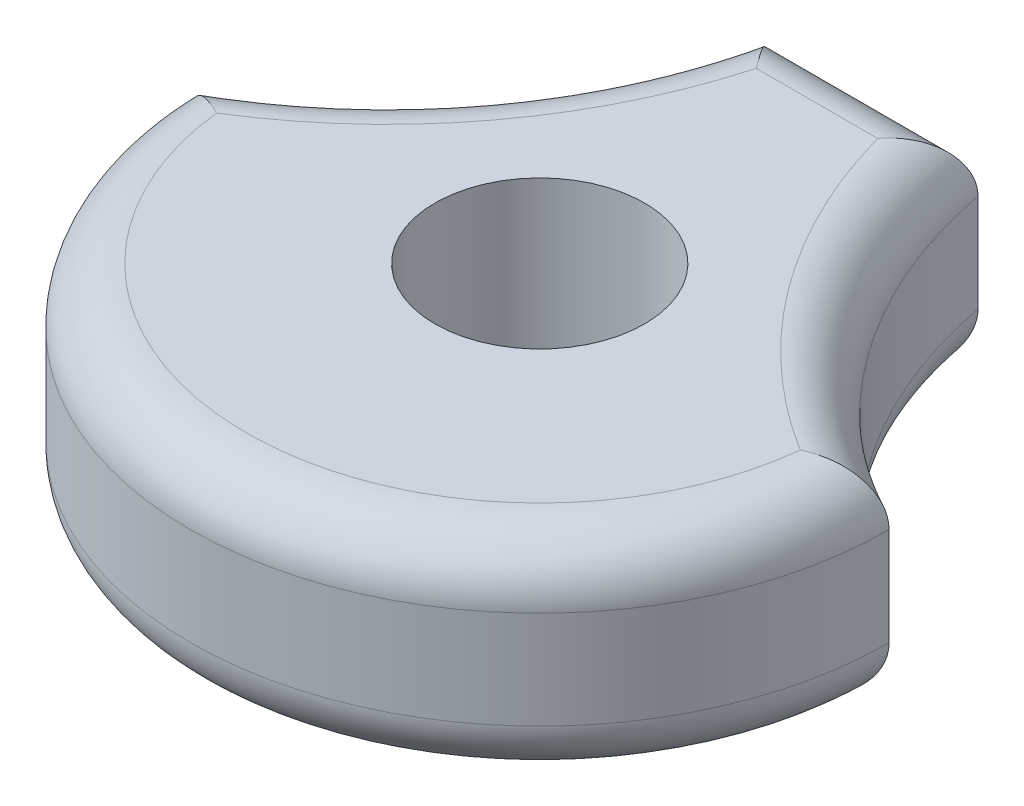
ISO-10303-21;
HEADER;
FILE_DESCRIPTION(('STEP AP214'),'2;1');
FILE_NAME('part.step','',(''),(''),'','','');
FILE_SCHEMA(('AUTOMOTIVE_DESIGN { 1 0 10303 214 1 1 1 1 }'));
ENDSEC;
DATA;
#1=APPLICATION_CONTEXT('core data for automotive mechanical design processes');
#2=APPLICATION_PROTOCOL_DEFINITION('international standard','automotive_design',2000,#1);
#3=PRODUCT_CONTEXT('',#1,'mechanical');
#4=PRODUCT('Part','Part','',(#3));
#5=PRODUCT_RELATED_PRODUCT_CATEGORY('part','',(#4));
#6=PRODUCT_DEFINITION_FORMATION('','',#4);
#7=PRODUCT_DEFINITION_CONTEXT('part definition',#1,'design');
#8=PRODUCT_DEFINITION('design','',#6,#7);
#9=PRODUCT_DEFINITION_SHAPE('','',#8);
#10=(LENGTH_UNIT() NAMED_UNIT(*) SI_UNIT(.MILLI.,.METRE.));
#11=(NAMED_UNIT(*) PLANE_ANGLE_UNIT() SI_UNIT($,.RADIAN.));
#12=(NAMED_UNIT(*) SI_UNIT($,.STERADIAN.) SOLID_ANGLE_UNIT());
#13=UNCERTAINTY_MEASURE_WITH_UNIT(LENGTH_MEASURE(1.E-05),#10,'distance_accuracy_value','');
#14=(GEOMETRIC_REPRESENTATION_CONTEXT(3) GLOBAL_UNCERTAINTY_ASSIGNED_CONTEXT((#13)) GLOBAL_UNIT_ASSIGNED_CONTEXT((#10,
#11,#12)) REPRESENTATION_CONTEXT('',''));
#15=CARTESIAN_POINT('',(0.,0.,0.));
#16=DIRECTION('',(0.,0.,1.));
#17=DIRECTION('',(1.,0.,0.));
#18=AXIS2_PLACEMENT_3D('',#15,#16,#17);
#19=CARTESIAN_POINT('',(-1.02382791124329,0.375,-0.750623938609286));
#20=DIRECTION('',(0.,-1.,0.));
#21=DIRECTION('',(0.,0.,-1.));
#22=AXIS2_PLACEMENT_3D('',#19,#20,#21);
#23=CYLINDRICAL_SURFACE('',#22,0.85);
#24=DIRECTION('',(0.,-1.,0.));
#25=VECTOR('',#24,1.);
#26=CARTESIAN_POINT('',(-0.188,0.375,-0.596054527706988));
#27=LINE('',#26,#25);
#28=CARTESIAN_POINT('',(-0.188,0.275,-0.596054527706988));
#29=VERTEX_POINT('',#28);
#30=CARTESIAN_POINT('',(-0.188,0.1,-0.596054527706988));
#31=VERTEX_POINT('',#30);
#32=EDGE_CURVE('E310',#29,#31,#27,.T.);
#33=ORIENTED_EDGE('',*,*,#32,.T.);
#34=CARTESIAN_POINT('',(-1.02382791124329,0.1,-0.750623938609286));
#35=DIRECTION('',(0.,1.,0.));
#36=DIRECTION('',(0.,0.,1.));
#37=AXIS2_PLACEMENT_3D('',#34,#35,#36);
#38=CIRCLE('',#37,0.85);
#39=CARTESIAN_POINT('',(-0.625,0.1,0.));
#40=VERTEX_POINT('',#39);
#41=EDGE_CURVE('E176',#31,#40,#38,.F.);
#42=ORIENTED_EDGE('',*,*,#41,.T.);
#43=DIRECTION('',(0.,-1.,0.));
#44=VECTOR('',#43,1.);
#45=CARTESIAN_POINT('',(-0.625,0.375,0.));
#46=LINE('',#45,#44);
#47=CARTESIAN_POINT('',(-0.625,0.275,0.));
#48=VERTEX_POINT('',#47);
#49=EDGE_CURVE('E134',#48,#40,#46,.T.);
#50=ORIENTED_EDGE('',*,*,#49,.F.);
#51=CARTESIAN_POINT('',(-1.02382791124329,0.275,-0.750623938609286));
#52=DIRECTION('',(0.,1.,0.));
#53=DIRECTION('',(0.,0.,1.));
#54=AXIS2_PLACEMENT_3D('',#51,#52,#53);
#55=CIRCLE('',#54,0.85);
#56=EDGE_CURVE('E172',#48,#29,#55,.T.);
#57=ORIENTED_EDGE('',*,*,#56,.T.);
#58=EDGE_LOOP('',(#33,#42,#50,#57));
#59=FACE_BOUND('',#58,.T.);
#60=ADVANCED_FACE('F39',(#59),#23,.F.);
#61=CARTESIAN_POINT('',(0.,0.375,0.));
#62=DIRECTION('',(0.,-1.,0.));
#63=DIRECTION('',(0.,0.,-1.));
#64=AXIS2_PLACEMENT_3D('',#61,#62,#63);
#65=CYLINDRICAL_SURFACE('',#64,0.625);
#66=ORIENTED_EDGE('',*,*,#49,.T.);
#67=CARTESIAN_POINT('',(0.,0.1,0.));
#68=DIRECTION('',(0.,1.,0.));
#69=DIRECTION('',(0.,0.,1.));
#70=AXIS2_PLACEMENT_3D('',#67,#68,#69);
#71=CIRCLE('',#70,0.625);
#72=CARTESIAN_POINT('',(0.625,0.1,0.));
#73=VERTEX_POINT('',#72);
#74=EDGE_CURVE('E132',#40,#73,#71,.T.);
#75=ORIENTED_EDGE('',*,*,#74,.T.);
#76=DIRECTION('',(0.,-1.,0.));
#77=VECTOR('',#76,1.);
#78=CARTESIAN_POINT('',(0.625,0.375,0.));
#79=LINE('',#78,#77);
#80=CARTESIAN_POINT('',(0.625,0.275,0.));
#81=VERTEX_POINT('',#80);
#82=EDGE_CURVE('E114',#81,#73,#79,.T.);
#83=ORIENTED_EDGE('',*,*,#82,.F.);
#84=CARTESIAN_POINT('',(0.,0.275,0.));
#85=DIRECTION('',(0.,1.,0.));
#86=DIRECTION('',(0.,0.,1.));
#87=AXIS2_PLACEMENT_3D('',#84,#85,#86);
#88=CIRCLE('',#87,0.625);
#89=EDGE_CURVE('E129',#81,#48,#88,.F.);
#90=ORIENTED_EDGE('',*,*,#89,.T.);
#91=EDGE_LOOP('',(#66,#75,#83,#90));
#92=FACE_BOUND('',#91,.T.);
#93=ADVANCED_FACE('F127',(#92),#65,.T.);
#94=CARTESIAN_POINT('',(1.02382791124329,0.375,-0.750623938609286));
#95=DIRECTION('',(0.,-1.,0.));
#96=DIRECTION('',(0.,0.,-1.));
#97=AXIS2_PLACEMENT_3D('',#94,#95,#96);
#98=CYLINDRICAL_SURFACE('',#97,0.85);
#99=ORIENTED_EDGE('',*,*,#82,.T.);
#100=CARTESIAN_POINT('',(1.02382791124329,0.1,-0.750623938609286));
#101=DIRECTION('',(0.,1.,0.));
#102=DIRECTION('',(0.,0.,1.));
#103=AXIS2_PLACEMENT_3D('',#100,#101,#102);
#104=CIRCLE('',#103,0.85);
#105=CARTESIAN_POINT('',(0.188,0.1,-0.596054527706988));
#106=VERTEX_POINT('',#105);
#107=EDGE_CURVE('E121',#73,#106,#104,.F.);
#108=ORIENTED_EDGE('',*,*,#107,.T.);
#109=DIRECTION('',(0.,-1.,0.));
#110=VECTOR('',#109,1.);
#111=CARTESIAN_POINT('',(0.188,0.375,-0.596054527706988));
#112=LINE('',#111,#110);
#113=CARTESIAN_POINT('',(0.188,0.275,-0.596054527706988));
#114=VERTEX_POINT('',#113);
#115=EDGE_CURVE('E116',#114,#106,#112,.T.);
#116=ORIENTED_EDGE('',*,*,#115,.F.);
#117=CARTESIAN_POINT('',(1.02382791124329,0.275,-0.750623938609286));
#118=DIRECTION('',(0.,1.,0.));
#119=DIRECTION('',(0.,0.,1.));
#120=AXIS2_PLACEMENT_3D('',#117,#118,#119);
#121=CIRCLE('',#120,0.85);
#122=EDGE_CURVE('E111',#114,#81,#121,.T.);
#123=ORIENTED_EDGE('',*,*,#122,.T.);
#124=EDGE_LOOP('',(#99,#108,#116,#123));
#125=FACE_BOUND('',#124,.T.);
#126=ADVANCED_FACE('F113',(#125),#98,.F.);
#127=CARTESIAN_POINT('',(-0.188,0.375,-0.596054527706988));
#128=DIRECTION('',(0.,0.,1.));
#129=DIRECTION('',(1.,0.,0.));
#130=AXIS2_PLACEMENT_3D('',#127,#128,#129);
#131=PLANE('',#130);
#132=ORIENTED_EDGE('',*,*,#115,.T.);
#133=DIRECTION('',(-1.,0.,0.));
#134=VECTOR('',#133,1.);
#135=CARTESIAN_POINT('',(-0.188,0.1,-0.596054527706988));
#136=LINE('',#135,#134);
#137=EDGE_CURVE('E169',#106,#31,#136,.T.);
#138=ORIENTED_EDGE('',*,*,#137,.T.);
#139=ORIENTED_EDGE('',*,*,#32,.F.);
#140=DIRECTION('',(-1.,0.,0.));
#141=VECTOR('',#140,1.);
#142=CARTESIAN_POINT('',(0.188,0.275,-0.596054527706988));
#143=LINE('',#142,#141);
#144=EDGE_CURVE('E166',#29,#114,#143,.F.);
#145=ORIENTED_EDGE('',*,*,#144,.T.);
#146=EDGE_LOOP('',(#132,#138,#139,#145));
#147=FACE_BOUND('',#146,.T.);
#148=ADVANCED_FACE('F273',(#147),#131,.F.);
#149=CARTESIAN_POINT('',(-1.02382791124329,0.375,-0.750623938609286));
#150=DIRECTION('',(0.,1.,0.));
#151=DIRECTION('',(0.,0.,1.));
#152=AXIS2_PLACEMENT_3D('',#149,#150,#151);
#153=PLANE('',#152);
#154=DIRECTION('',(-1.,0.,0.));
#155=VECTOR('',#154,1.);
#156=CARTESIAN_POINT('',(-0.188,0.375,-0.496054527706987));
#157=LINE('',#156,#155);
#158=CARTESIAN_POINT('',(0.108571436241412,0.375,-0.496054527706991));
#159=VERTEX_POINT('',#158);
#160=CARTESIAN_POINT('',(-0.108571436241412,0.375,-0.496054527706987));
#161=VERTEX_POINT('',#160);
#162=EDGE_CURVE('E54',#159,#161,#157,.T.);
#163=ORIENTED_EDGE('',*,*,#162,.T.);
#164=CARTESIAN_POINT('',(-1.02382791124329,0.375,-0.750623938609286));
#165=DIRECTION('',(0.,1.,0.));
#166=DIRECTION('',(0.,0.,1.));
#167=AXIS2_PLACEMENT_3D('',#164,#165,#166);
#168=CIRCLE('',#167,0.95);
#169=CARTESIAN_POINT('',(-0.522002833056028,0.375,0.0560182316882701));
#170=VERTEX_POINT('',#169);
#171=EDGE_CURVE('E11',#161,#170,#168,.F.);
#172=ORIENTED_EDGE('',*,*,#171,.T.);
#173=CARTESIAN_POINT('',(0.,0.375,0.));
#174=DIRECTION('',(0.,1.,0.));
#175=DIRECTION('',(0.,0.,1.));
#176=AXIS2_PLACEMENT_3D('',#173,#174,#175);
#177=CIRCLE('',#176,0.525);
#178=CARTESIAN_POINT('',(0.522002833056028,0.375,0.0560182316882701));
#179=VERTEX_POINT('',#178);
#180=EDGE_CURVE('E179',#170,#179,#177,.T.);
#181=ORIENTED_EDGE('',*,*,#180,.T.);
#182=CARTESIAN_POINT('',(1.02382791124329,0.375,-0.750623938609286));
#183=DIRECTION('',(0.,1.,0.));
#184=DIRECTION('',(0.,0.,1.));
#185=AXIS2_PLACEMENT_3D('',#182,#183,#184);
#186=CIRCLE('',#185,0.95);
#187=EDGE_CURVE('E65',#179,#159,#186,.F.);
#188=ORIENTED_EDGE('',*,*,#187,.T.);
#189=EDGE_LOOP('',(#163,#172,#181,#188));
#190=FACE_BOUND('',#189,.T.);
#191=CARTESIAN_POINT('',(0.,0.375,0.));
#192=DIRECTION('',(0.,1.,0.));
#193=DIRECTION('',(0.,0.,1.));
#194=AXIS2_PLACEMENT_3D('',#191,#192,#193);
#195=CIRCLE('',#194,0.1875);
#196=CARTESIAN_POINT('',(0.,0.375,0.1875));
#197=VERTEX_POINT('',#196);
#198=EDGE_CURVE('E228',#197,#197,#195,.T.);
#199=ORIENTED_EDGE('',*,*,#198,.F.);
#200=EDGE_LOOP('',(#199));
#201=FACE_BOUND('',#200,.T.);
#202=ADVANCED_FACE('F276',(#190,#201),#153,.T.);
#203=CARTESIAN_POINT('',(-1.02382791124329,0.,-0.750623938609286));
#204=DIRECTION('',(0.,1.,0.));
#205=DIRECTION('',(0.,0.,1.));
#206=AXIS2_PLACEMENT_3D('',#203,#204,#205);
#207=PLANE('',#206);
#208=CARTESIAN_POINT('',(0.,0.,-0.375));
#209=DIRECTION('',(0.,-1.,0.));
#210=DIRECTION('',(0.,0.,-1.));
#211=AXIS2_PLACEMENT_3D('',#208,#209,#210);
#212=CIRCLE('',#211,0.0935);
#213=CARTESIAN_POINT('',(0.,0.,-0.4685));
#214=VERTEX_POINT('',#213);
#215=EDGE_CURVE('E300',#214,#214,#212,.T.);
#216=ORIENTED_EDGE('',*,*,#215,.F.);
#217=EDGE_LOOP('',(#216));
#218=FACE_BOUND('',#217,.T.);
#219=CARTESIAN_POINT('',(1.02382791124329,0.,-0.750623938609286));
#220=DIRECTION('',(0.,1.,0.));
#221=DIRECTION('',(0.,0.,1.));
#222=AXIS2_PLACEMENT_3D('',#219,#220,#221);
#223=CIRCLE('',#222,0.95);
#224=CARTESIAN_POINT('',(0.108571436241412,0.,-0.496054527706987));
#225=VERTEX_POINT('',#224);
#226=CARTESIAN_POINT('',(0.522002833056028,0.,0.0560182316882701));
#227=VERTEX_POINT('',#226);
#228=EDGE_CURVE('E158',#225,#227,#223,.T.);
#229=ORIENTED_EDGE('',*,*,#228,.T.);
#230=CARTESIAN_POINT('',(0.,0.,0.));
#231=DIRECTION('',(0.,1.,0.));
#232=DIRECTION('',(0.,0.,1.));
#233=AXIS2_PLACEMENT_3D('',#230,#231,#232);
#234=CIRCLE('',#233,0.525);
#235=CARTESIAN_POINT('',(-0.522002833056028,0.,0.0560182316882701));
#236=VERTEX_POINT('',#235);
#237=EDGE_CURVE('E122',#227,#236,#234,.F.);
#238=ORIENTED_EDGE('',*,*,#237,.T.);
#239=CARTESIAN_POINT('',(-1.02382791124329,0.,-0.750623938609286));
#240=DIRECTION('',(0.,1.,0.));
#241=DIRECTION('',(0.,0.,1.));
#242=AXIS2_PLACEMENT_3D('',#239,#240,#241);
#243=CIRCLE('',#242,0.95);
#244=CARTESIAN_POINT('',(-0.108571436241412,0.,-0.496054527706991));
#245=VERTEX_POINT('',#244);
#246=EDGE_CURVE('E149',#236,#245,#243,.T.);
#247=ORIENTED_EDGE('',*,*,#246,.T.);
#248=DIRECTION('',(-1.,0.,0.));
#249=VECTOR('',#248,1.);
#250=CARTESIAN_POINT('',(-1.02382791124329,0.,-0.496054527706987));
#251=LINE('',#250,#249);
#252=EDGE_CURVE('E155',#245,#225,#251,.F.);
#253=ORIENTED_EDGE('',*,*,#252,.T.);
#254=EDGE_LOOP('',(#229,#238,#247,#253));
#255=FACE_BOUND('',#254,.T.);
#256=CARTESIAN_POINT('',(0.,0.,0.));
#257=DIRECTION('',(0.,1.,0.));
#258=DIRECTION('',(0.,0.,1.));
#259=AXIS2_PLACEMENT_3D('',#256,#257,#258);
#260=CIRCLE('',#259,0.1875);
#261=CARTESIAN_POINT('',(0.,0.,0.1875));
#262=VERTEX_POINT('',#261);
#263=EDGE_CURVE('E306',#262,#262,#260,.T.);
#264=ORIENTED_EDGE('',*,*,#263,.T.);
#265=EDGE_LOOP('',(#264));
#266=FACE_BOUND('',#265,.T.);
#267=ADVANCED_FACE('F278',(#218,#255,#266),#207,.F.);
#268=CARTESIAN_POINT('',(0.,0.,0.));
#269=DIRECTION('',(0.,1.,0.));
#270=DIRECTION('',(0.,0.,1.));
#271=AXIS2_PLACEMENT_3D('',#268,#269,#270);
#272=CYLINDRICAL_SURFACE('',#271,0.1875);
#273=ORIENTED_EDGE('',*,*,#263,.F.);
#274=EDGE_LOOP('',(#273));
#275=FACE_BOUND('',#274,.T.);
#276=ORIENTED_EDGE('',*,*,#198,.T.);
#277=EDGE_LOOP('',(#276));
#278=FACE_BOUND('',#277,.T.);
#279=ADVANCED_FACE('F281',(#275,#278),#272,.F.);
#280=CARTESIAN_POINT('',(-0.188,0.1,-0.496054527706987));
#281=DIRECTION('',(-1.,0.,0.));
#282=DIRECTION('',(0.,0.,1.));
#283=AXIS2_PLACEMENT_3D('',#280,#281,#282);
#284=CYLINDRICAL_SURFACE('',#283,0.1);
#285=CARTESIAN_POINT('',(0.188,0.1,-0.596054527706988));
#286=CARTESIAN_POINT('',(0.188006563340456,0.0952662798120291,-0.59606183198076));
#287=CARTESIAN_POINT('',(0.187720766170187,0.0905421641596065,-0.595718934787511));
#288=CARTESIAN_POINT('',(0.186620382605794,0.081281186151583,-0.594395381848338));
#289=CARTESIAN_POINT('',(0.185809635655904,0.0767432165946548,-0.593419356659604));
#290=CARTESIAN_POINT('',(0.183716041360385,0.067959406024845,-0.590893235565373));
#291=CARTESIAN_POINT('',(0.182434181668559,0.0637129757664542,-0.589344340597115));
#292=CARTESIAN_POINT('',(0.179473353596753,0.0555760245358786,-0.585755792830976));
#293=CARTESIAN_POINT('',(0.177793647235535,0.0516861838407015,-0.583715227892333));
#294=CARTESIAN_POINT('',(0.173502032914405,0.0430912270278644,-0.578482792029683));
#295=CARTESIAN_POINT('',(0.170765750086057,0.0385439237631463,-0.575133575737485));
#296=CARTESIAN_POINT('',(0.164881521839847,0.0302136238312448,-0.567890750637346));
#297=CARTESIAN_POINT('',(0.161732895569461,0.0264319181886154,-0.56399624070031));
#298=CARTESIAN_POINT('',(0.15429624347707,0.018755514702494,-0.55474205475707));
#299=CARTESIAN_POINT('',(0.149924285663846,0.0150850803185265,-0.549264102862823));
#300=CARTESIAN_POINT('',(0.140913049677504,0.00893772115778066,-0.537881922335268));
#301=CARTESIAN_POINT('',(0.136273682467073,0.00646119650842118,-0.531977551552962));
#302=CARTESIAN_POINT('',(0.127981869878933,0.00312903927751003,-0.521339027827265));
#303=CARTESIAN_POINT('',(0.124355701067012,0.00202851145660351,-0.516658622885531));
#304=CARTESIAN_POINT('',(0.117083225795594,0.000509951573807847,-0.507214273394175));
#305=CARTESIAN_POINT('',(0.113436971678063,9.060700672305E-05,-0.502450507418318));
#306=CARTESIAN_POINT('',(0.10939341960956,4.3855613286069E-06,-0.497135978271487));
#307=CARTESIAN_POINT('',(0.108982318322315,-8.66163361649267E-10,-0.496595292339174));
#308=CARTESIAN_POINT('',(0.108571436241413,0.,-0.496054527706987));
#309=B_SPLINE_CURVE_WITH_KNOTS('',3,(#285,#286,#287,#288,#289,#290,#291,#292,#293,#294,#295,
#296,#297,#298,#299,#300,#301,#302,#303,#304,#305,#306,#307,#308),.UNSPECIFIED.,.F.,.F.,(4,2,2,
2,2,2,2,2,2,2,2,4),(0.,0.0141649397828813,0.028227430937291,0.0422606077133319,
0.0563200218986589,0.075045017196368,0.0938013300918819,0.117413981718386,0.141034541407169,
0.159065059166736,0.17706079430339,0.179098443734128),.UNSPECIFIED.);
#310=EDGE_CURVE('E229',#225,#106,#309,.F.);
#311=ORIENTED_EDGE('',*,*,#310,.F.);
#312=ORIENTED_EDGE('',*,*,#252,.F.);
#313=CARTESIAN_POINT('',(-0.188,0.1,-0.596054527706988));
#314=CARTESIAN_POINT('',(-0.188006563340456,0.0952662798120291,-0.59606183198076));
#315=CARTESIAN_POINT('',(-0.187720766170187,0.0905421641596066,-0.595718934787511));
#316=CARTESIAN_POINT('',(-0.186620382605794,0.081281186151583,-0.594395381848338));
#317=CARTESIAN_POINT('',(-0.185809635655905,0.0767432165946548,-0.593419356659604));
#318=CARTESIAN_POINT('',(-0.183716041360386,0.067959406024845,-0.590893235565373));
#319=CARTESIAN_POINT('',(-0.182434181668559,0.0637129757664542,-0.589344340597115));
#320=CARTESIAN_POINT('',(-0.179473353596753,0.0555760245358786,-0.585755792830976));
#321=CARTESIAN_POINT('',(-0.177793647235535,0.0516861838407015,-0.583715227892333));
#322=CARTESIAN_POINT('',(-0.173502032914405,0.0430912270278644,-0.578482792029683));
#323=CARTESIAN_POINT('',(-0.170765750086057,0.0385439237631463,-0.575133575737485));
#324=CARTESIAN_POINT('',(-0.164881521839847,0.0302136238312449,-0.567890750637347));
#325=CARTESIAN_POINT('',(-0.161732895569461,0.0264319181886154,-0.56399624070031));
#326=CARTESIAN_POINT('',(-0.154296243477071,0.018755514702494,-0.55474205475707));
#327=CARTESIAN_POINT('',(-0.149924285663846,0.0150850803185265,-0.549264102862823));
#328=CARTESIAN_POINT('',(-0.140913049677504,0.00893772115778071,-0.537881922335269));
#329=CARTESIAN_POINT('',(-0.136273682467073,0.00646119650842122,-0.531977551552962));
#330=CARTESIAN_POINT('',(-0.127981869878933,0.00312903927751005,-0.521339027827265));
#331=CARTESIAN_POINT('',(-0.124355701067012,0.00202851145660352,-0.516658622885531));
#332=CARTESIAN_POINT('',(-0.117083225795594,0.000509951573807843,-0.507214273394175));
#333=CARTESIAN_POINT('',(-0.113436971678063,9.06070067230273E-05,-0.502450507418318));
#334=CARTESIAN_POINT('',(-0.10939341960956,4.38556132860204E-06,-0.497135978271487));
#335=CARTESIAN_POINT('',(-0.108982318322315,-8.66163364271393E-10,-0.496595292339174));
#336=CARTESIAN_POINT('',(-0.108571436241413,0.,-0.496054527706987));
#337=B_SPLINE_CURVE_WITH_KNOTS('',3,(#313,#314,#315,#316,#317,#318,#319,#320,#321,#322,#323,
#324,#325,#326,#327,#328,#329,#330,#331,#332,#333,#334,#335,#336),.UNSPECIFIED.,.F.,.F.,(4,2,2,
2,2,2,2,2,2,2,2,4),(0.,0.0141649397828813,0.0282274309372909,0.0422606077133319,
0.0563200218986589,0.075045017196368,0.0938013300918819,0.117413981718386,0.141034541407168,
0.159065059166736,0.17706079430339,0.179098443734128),.UNSPECIFIED.);
#338=EDGE_CURVE('E220',#31,#245,#337,.T.);
#339=ORIENTED_EDGE('',*,*,#338,.F.);
#340=ORIENTED_EDGE('',*,*,#137,.F.);
#341=EDGE_LOOP('',(#311,#312,#339,#340));
#342=FACE_BOUND('',#341,.T.);
#343=ADVANCED_FACE('F214',(#342),#284,.T.);
#344=CARTESIAN_POINT('',(-1.02382791124329,0.1,-0.750623938609286));
#345=DIRECTION('',(0.,1.,0.));
#346=DIRECTION('',(0.,0.,1.));
#347=AXIS2_PLACEMENT_3D('',#344,#345,#346);
#348=TOROIDAL_SURFACE('',#347,0.95,0.1);
#349=ORIENTED_EDGE('',*,*,#338,.T.);
#350=ORIENTED_EDGE('',*,*,#246,.F.);
#351=CARTESIAN_POINT('',(-0.625,0.1,0.));
#352=CARTESIAN_POINT('',(-0.625006248304746,0.0949499575277534,-4.68483873560888E-06));
#353=CARTESIAN_POINT('',(-0.624617940008275,0.0899058593775294,0.000229645210863099));
#354=CARTESIAN_POINT('',(-0.623103122204652,0.0799928315947973,0.00113866526372481));
#355=CARTESIAN_POINT('',(-0.62197992068122,0.075123219662988,0.00181138189813343));
#356=CARTESIAN_POINT('',(-0.61904677009251,0.0656791180225825,0.00355930430958048));
#357=CARTESIAN_POINT('',(-0.61723745268898,0.0611043613787963,0.00463413986999876));
#358=CARTESIAN_POINT('',(-0.613009034931627,0.0523454811178933,0.00712846534253852));
#359=CARTESIAN_POINT('',(-0.610589406573738,0.0481617000666786,0.00854825364757706));
#360=CARTESIAN_POINT('',(-0.605083846171722,0.0400516397086707,0.0117512652163224));
#361=CARTESIAN_POINT('',(-0.601969274689386,0.0361509697864365,0.0135498257632184));
#362=CARTESIAN_POINT('',(-0.595261375717179,0.0289219053689162,0.0173827699082739));
#363=CARTESIAN_POINT('',(-0.591667925495926,0.0255936580818483,0.0194172139433618));
#364=CARTESIAN_POINT('',(-0.583587172814163,0.0191302094152413,0.0239383337630312));
#365=CARTESIAN_POINT('',(-0.579044639502886,0.0160809682039057,0.0264490496776632));
#366=CARTESIAN_POINT('',(-0.569585225065183,0.0107692795124608,0.0316002099145605));
#367=CARTESIAN_POINT('',(-0.564667960920598,0.00850765057401546,0.0342407859643633));
#368=CARTESIAN_POINT('',(-0.553902382268432,0.00452793567269491,0.039929957375898));
#369=CARTESIAN_POINT('',(-0.548016999816633,0.00292147496909523,0.0429862821702155));
#370=CARTESIAN_POINT('',(-0.536060513367811,0.000717750080724119,0.0490759157133926));
#371=CARTESIAN_POINT('',(-0.529989773908047,0.000118620466160505,0.0521092566272977));
#372=CARTESIAN_POINT('',(-0.523265387140807,5.30274190180995E-06,0.0554019592372618));
#373=CARTESIAN_POINT('',(-0.522634189929464,-7.11696364068901E-09,0.0557103840664415));
#374=CARTESIAN_POINT('',(-0.522002833056028,0.,0.0560182316882701));
#375=B_SPLINE_CURVE_WITH_KNOTS('',3,(#351,#352,#353,#354,#355,#356,#357,#358,#359,#360,#361,
#362,#363,#364,#365,#366,#367,#368,#369,#370,#371,#372,#373,#374),.UNSPECIFIED.,.F.,.F.,(4,2,2,
2,2,2,2,2,2,2,2,4),(0.,0.015120459551688,0.0301733211578215,0.0452123580971804,
0.060264450796014,0.0761187960680716,0.0919772124779771,0.109965475541805,0.127972377862322,
0.148363620337012,0.168717059453063,0.170824587665778),.UNSPECIFIED.);
#376=EDGE_CURVE('E195',#40,#236,#375,.T.);
#377=ORIENTED_EDGE('',*,*,#376,.F.);
#378=ORIENTED_EDGE('',*,*,#41,.F.);
#379=EDGE_LOOP('',(#349,#350,#377,#378));
#380=FACE_BOUND('',#379,.T.);
#381=ADVANCED_FACE('F209',(#380),#348,.T.);
#382=CARTESIAN_POINT('',(1.02382791124329,0.1,-0.750623938609286));
#383=DIRECTION('',(0.,1.,0.));
#384=DIRECTION('',(0.,0.,1.));
#385=AXIS2_PLACEMENT_3D('',#382,#383,#384);
#386=TOROIDAL_SURFACE('',#385,0.95,0.1);
#387=ORIENTED_EDGE('',*,*,#310,.T.);
#388=ORIENTED_EDGE('',*,*,#107,.F.);
#389=CARTESIAN_POINT('',(0.625,0.1,0.));
#390=CARTESIAN_POINT('',(0.625006248304746,0.0949499575277534,-4.68483873563268E-06));
#391=CARTESIAN_POINT('',(0.624617940008275,0.0899058593775294,0.000229645210863032));
#392=CARTESIAN_POINT('',(0.623103122204652,0.0799928315947973,0.00113866526372471));
#393=CARTESIAN_POINT('',(0.62197992068122,0.0751232196629879,0.00181138189813335));
#394=CARTESIAN_POINT('',(0.61904677009251,0.0656791180225825,0.00355930430958044));
#395=CARTESIAN_POINT('',(0.61723745268898,0.0611043613787964,0.00463413986999876));
#396=CARTESIAN_POINT('',(0.613009034931627,0.0523454811178934,0.00712846534253858));
#397=CARTESIAN_POINT('',(0.610589406573738,0.0481617000666786,0.00854825364757715));
#398=CARTESIAN_POINT('',(0.605083846171722,0.0400516397086707,0.0117512652163224));
#399=CARTESIAN_POINT('',(0.601969274689386,0.0361509697864365,0.0135498257632183));
#400=CARTESIAN_POINT('',(0.595261375717179,0.0289219053689162,0.0173827699082738));
#401=CARTESIAN_POINT('',(0.591667925495925,0.0255936580818483,0.0194172139433617));
#402=CARTESIAN_POINT('',(0.583587172814163,0.0191302094152413,0.0239383337630313));
#403=CARTESIAN_POINT('',(0.579044639502886,0.0160809682039057,0.0264490496776634));
#404=CARTESIAN_POINT('',(0.569585225065183,0.0107692795124607,0.0316002099145606));
#405=CARTESIAN_POINT('',(0.564667960920598,0.00850765057401543,0.0342407859643633));
#406=CARTESIAN_POINT('',(0.553902382268432,0.00452793567269489,0.0399299573758982));
#407=CARTESIAN_POINT('',(0.548016999816633,0.00292147496909519,0.0429862821702159));
#408=CARTESIAN_POINT('',(0.536060513367811,0.000717750080724098,0.0490759157133923));
#409=CARTESIAN_POINT('',(0.529989773908046,0.000118620466160515,0.0521092566272965));
#410=CARTESIAN_POINT('',(0.523265387140807,5.30274190181263E-06,0.0554019592372616));
#411=CARTESIAN_POINT('',(0.522634189929464,-7.11696363902323E-09,0.0557103840664414));
#412=CARTESIAN_POINT('',(0.522002833056028,0.,0.0560182316882702));
#413=B_SPLINE_CURVE_WITH_KNOTS('',3,(#389,#390,#391,#392,#393,#394,#395,#396,#397,#398,#399,
#400,#401,#402,#403,#404,#405,#406,#407,#408,#409,#410,#411,#412),.UNSPECIFIED.,.F.,.F.,(4,2,2,
2,2,2,2,2,2,2,2,4),(0.,0.015120459551688,0.0301733211578216,0.0452123580971803,
0.0602644507960141,0.0761187960680717,0.0919772124779772,0.109965475541805,0.127972377862322,
0.148363620337012,0.168717059453063,0.170824587665778),.UNSPECIFIED.);
#414=EDGE_CURVE('E186',#227,#73,#413,.F.);
#415=ORIENTED_EDGE('',*,*,#414,.F.);
#416=ORIENTED_EDGE('',*,*,#228,.F.);
#417=EDGE_LOOP('',(#387,#388,#415,#416));
#418=FACE_BOUND('',#417,.T.);
#419=ADVANCED_FACE('F202',(#418),#386,.T.);
#420=CARTESIAN_POINT('',(0.,0.1,0.));
#421=DIRECTION('',(0.,1.,0.));
#422=DIRECTION('',(0.,0.,1.));
#423=AXIS2_PLACEMENT_3D('',#420,#421,#422);
#424=TOROIDAL_SURFACE('',#423,0.525,0.1);
#425=ORIENTED_EDGE('',*,*,#376,.T.);
#426=ORIENTED_EDGE('',*,*,#237,.F.);
#427=ORIENTED_EDGE('',*,*,#414,.T.);
#428=ORIENTED_EDGE('',*,*,#74,.F.);
#429=EDGE_LOOP('',(#425,#426,#427,#428));
#430=FACE_BOUND('',#429,.T.);
#431=ADVANCED_FACE('F205',(#430),#424,.T.);
#432=CARTESIAN_POINT('',(1.02382791124329,0.275,-0.750623938609286));
#433=DIRECTION('',(0.,1.,0.));
#434=DIRECTION('',(0.,0.,1.));
#435=AXIS2_PLACEMENT_3D('',#432,#433,#434);
#436=TOROIDAL_SURFACE('',#435,0.95,0.1);
#437=CARTESIAN_POINT('',(0.625,0.275,0.));
#438=CARTESIAN_POINT('',(0.625006248304746,0.280050042472247,-4.68483873561841E-06));
#439=CARTESIAN_POINT('',(0.624617940008275,0.285094140622471,0.00022964521086305));
#440=CARTESIAN_POINT('',(0.623103122204652,0.295007168405203,0.00113866526372473));
#441=CARTESIAN_POINT('',(0.62197992068122,0.299876780337012,0.00181138189813336));
#442=CARTESIAN_POINT('',(0.61904677009251,0.309320881977418,0.00355930430958044));
#443=CARTESIAN_POINT('',(0.61723745268898,0.313895638621204,0.00463413986999876));
#444=CARTESIAN_POINT('',(0.613009034931627,0.322654518882107,0.00712846534253859));
#445=CARTESIAN_POINT('',(0.610589406573738,0.326838299933321,0.00854825364757717));
#446=CARTESIAN_POINT('',(0.605083846171722,0.334948360291329,0.0117512652163224));
#447=CARTESIAN_POINT('',(0.601969274689386,0.338849030213564,0.0135498257632183));
#448=CARTESIAN_POINT('',(0.595261375717179,0.346078094631084,0.0173827699082737));
#449=CARTESIAN_POINT('',(0.591667925495925,0.349406341918152,0.0194172139433618));
#450=CARTESIAN_POINT('',(0.583587172814163,0.355869790584759,0.0239383337630313));
#451=CARTESIAN_POINT('',(0.579044639502886,0.358919031796094,0.0264490496776634));
#452=CARTESIAN_POINT('',(0.569585225065183,0.364230720487539,0.0316002099145606));
#453=CARTESIAN_POINT('',(0.564667960920598,0.366492349425985,0.0342407859643633));
#454=CARTESIAN_POINT('',(0.553902382268432,0.370472064327305,0.0399299573758981));
#455=CARTESIAN_POINT('',(0.548016999816633,0.372078525030905,0.0429862821702156));
#456=CARTESIAN_POINT('',(0.536060513367811,0.374282249919276,0.0490759157133923));
#457=CARTESIAN_POINT('',(0.529989773908046,0.374881379533839,0.0521092566272968));
#458=CARTESIAN_POINT('',(0.523265387140807,0.374994697258098,0.0554019592372617));
#459=CARTESIAN_POINT('',(0.522634189929464,0.375000007116964,0.0557103840664414));
#460=CARTESIAN_POINT('',(0.522002833056028,0.375,0.0560182316882702));
#461=B_SPLINE_CURVE_WITH_KNOTS('',3,(#437,#438,#439,#440,#441,#442,#443,#444,#445,#446,#447,
#448,#449,#450,#451,#452,#453,#454,#455,#456,#457,#458,#459,#460),.UNSPECIFIED.,.F.,.F.,(4,2,2,
2,2,2,2,2,2,2,2,4),(0.,0.015120459551688,0.0301733211578216,0.0452123580971804,
0.0602644507960142,0.0761187960680717,0.0919772124779773,0.109965475541805,0.127972377862322,
0.148363620337012,0.168717059453062,0.170824587665778),.UNSPECIFIED.);
#462=EDGE_CURVE('E137',#81,#179,#461,.T.);
#463=ORIENTED_EDGE('',*,*,#462,.F.);
#464=ORIENTED_EDGE('',*,*,#122,.F.);
#465=CARTESIAN_POINT('',(0.188,0.275,-0.596054527706988));
#466=CARTESIAN_POINT('',(0.188006563340456,0.279733720187971,-0.59606183198076));
#467=CARTESIAN_POINT('',(0.187720766170187,0.284457835840393,-0.595718934787511));
#468=CARTESIAN_POINT('',(0.186620382605794,0.293718813848417,-0.594395381848338));
#469=CARTESIAN_POINT('',(0.185809635655904,0.298256783405345,-0.593419356659604));
#470=CARTESIAN_POINT('',(0.183716041360385,0.307040593975155,-0.590893235565373));
#471=CARTESIAN_POINT('',(0.182434181668559,0.311287024233546,-0.589344340597115));
#472=CARTESIAN_POINT('',(0.179473353596753,0.319423975464121,-0.585755792830975));
#473=CARTESIAN_POINT('',(0.177793647235535,0.323313816159298,-0.583715227892333));
#474=CARTESIAN_POINT('',(0.173502032914405,0.331908772972136,-0.578482792029683));
#475=CARTESIAN_POINT('',(0.170765750086057,0.336456076236854,-0.575133575737485));
#476=CARTESIAN_POINT('',(0.164881521839847,0.344786376168755,-0.567890750637346));
#477=CARTESIAN_POINT('',(0.161732895569461,0.348568081811385,-0.56399624070031));
#478=CARTESIAN_POINT('',(0.15429624347707,0.356244485297506,-0.55474205475707));
#479=CARTESIAN_POINT('',(0.149924285663846,0.359914919681474,-0.549264102862823));
#480=CARTESIAN_POINT('',(0.140913049677504,0.366062278842219,-0.537881922335268));
#481=CARTESIAN_POINT('',(0.136273682467073,0.368538803491579,-0.531977551552962));
#482=CARTESIAN_POINT('',(0.127981869878933,0.37187096072249,-0.521339027827265));
#483=CARTESIAN_POINT('',(0.124355701067012,0.372971488543396,-0.516658622885531));
#484=CARTESIAN_POINT('',(0.117083225795594,0.374490048426192,-0.507214273394175));
#485=CARTESIAN_POINT('',(0.113436971678063,0.374909392993277,-0.502450507418318));
#486=CARTESIAN_POINT('',(0.10939341960956,0.374995614438671,-0.497135978271487));
#487=CARTESIAN_POINT('',(0.108982318322315,0.375000000866163,-0.496595292339174));
#488=CARTESIAN_POINT('',(0.108571436241413,0.375,-0.496054527706987));
#489=B_SPLINE_CURVE_WITH_KNOTS('',3,(#465,#466,#467,#468,#469,#470,#471,#472,#473,#474,#475,
#476,#477,#478,#479,#480,#481,#482,#483,#484,#485,#486,#487,#488),.UNSPECIFIED.,.F.,.F.,(4,2,2,
2,2,2,2,2,2,2,2,4),(0.,0.0141649397828813,0.028227430937291,0.042260607713332,
0.0563200218986589,0.0750450171963681,0.0938013300918819,0.117413981718386,0.141034541407169,
0.159065059166736,0.17706079430339,0.179098443734128),.UNSPECIFIED.);
#490=EDGE_CURVE('E44',#159,#114,#489,.F.);
#491=ORIENTED_EDGE('',*,*,#490,.F.);
#492=ORIENTED_EDGE('',*,*,#187,.F.);
#493=EDGE_LOOP('',(#463,#464,#491,#492));
#494=FACE_BOUND('',#493,.T.);
#495=ADVANCED_FACE('F41',(#494),#436,.T.);
#496=CARTESIAN_POINT('',(-1.02382791124329,0.275,-0.496054527706987));
#497=DIRECTION('',(1.,0.,0.));
#498=DIRECTION('',(0.,0.,-1.));
#499=AXIS2_PLACEMENT_3D('',#496,#497,#498);
#500=CYLINDRICAL_SURFACE('',#499,0.1);
#501=ORIENTED_EDGE('',*,*,#490,.T.);
#502=ORIENTED_EDGE('',*,*,#144,.F.);
#503=CARTESIAN_POINT('',(-0.188,0.275,-0.596054527706988));
#504=CARTESIAN_POINT('',(-0.188006563340456,0.279733720187971,-0.59606183198076));
#505=CARTESIAN_POINT('',(-0.187720766170187,0.284457835840393,-0.595718934787511));
#506=CARTESIAN_POINT('',(-0.186620382605794,0.293718813848417,-0.594395381848338));
#507=CARTESIAN_POINT('',(-0.185809635655905,0.298256783405345,-0.593419356659604));
#508=CARTESIAN_POINT('',(-0.183716041360386,0.307040593975155,-0.590893235565373));
#509=CARTESIAN_POINT('',(-0.182434181668559,0.311287024233546,-0.589344340597115));
#510=CARTESIAN_POINT('',(-0.179473353596753,0.319423975464121,-0.585755792830976));
#511=CARTESIAN_POINT('',(-0.177793647235535,0.323313816159298,-0.583715227892333));
#512=CARTESIAN_POINT('',(-0.173502032914405,0.331908772972136,-0.578482792029683));
#513=CARTESIAN_POINT('',(-0.170765750086057,0.336456076236854,-0.575133575737485));
#514=CARTESIAN_POINT('',(-0.164881521839847,0.344786376168755,-0.567890750637346));
#515=CARTESIAN_POINT('',(-0.161732895569461,0.348568081811385,-0.56399624070031));
#516=CARTESIAN_POINT('',(-0.15429624347707,0.356244485297506,-0.55474205475707));
#517=CARTESIAN_POINT('',(-0.149924285663846,0.359914919681473,-0.549264102862823));
#518=CARTESIAN_POINT('',(-0.140913049677504,0.366062278842219,-0.537881922335269));
#519=CARTESIAN_POINT('',(-0.136273682467073,0.368538803491579,-0.531977551552962));
#520=CARTESIAN_POINT('',(-0.127981869878933,0.37187096072249,-0.521339027827265));
#521=CARTESIAN_POINT('',(-0.124355701067012,0.372971488543396,-0.516658622885531));
#522=CARTESIAN_POINT('',(-0.117083225795595,0.374490048426192,-0.507214273394175));
#523=CARTESIAN_POINT('',(-0.113436971678063,0.374909392993277,-0.502450507418318));
#524=CARTESIAN_POINT('',(-0.10939341960956,0.374995614438671,-0.497135978271487));
#525=CARTESIAN_POINT('',(-0.108982318322315,0.375000000866163,-0.496595292339174));
#526=CARTESIAN_POINT('',(-0.108571436241413,0.375,-0.496054527706987));
#527=B_SPLINE_CURVE_WITH_KNOTS('',3,(#503,#504,#505,#506,#507,#508,#509,#510,#511,#512,#513,
#514,#515,#516,#517,#518,#519,#520,#521,#522,#523,#524,#525,#526),.UNSPECIFIED.,.F.,.F.,(4,2,2,
2,2,2,2,2,2,2,2,4),(0.,0.0141649397828813,0.0282274309372909,0.0422606077133318,
0.0563200218986589,0.075045017196368,0.0938013300918819,0.117413981718386,0.141034541407168,
0.159065059166736,0.17706079430339,0.179098443734128),.UNSPECIFIED.);
#528=EDGE_CURVE('E141',#161,#29,#527,.F.);
#529=ORIENTED_EDGE('',*,*,#528,.F.);
#530=ORIENTED_EDGE('',*,*,#162,.F.);
#531=EDGE_LOOP('',(#501,#502,#529,#530));
#532=FACE_BOUND('',#531,.T.);
#533=ADVANCED_FACE('F250',(#532),#500,.T.);
#534=CARTESIAN_POINT('',(0.,0.275,0.));
#535=DIRECTION('',(0.,1.,0.));
#536=DIRECTION('',(0.,0.,1.));
#537=AXIS2_PLACEMENT_3D('',#534,#535,#536);
#538=TOROIDAL_SURFACE('',#537,0.525,0.1);
#539=ORIENTED_EDGE('',*,*,#462,.T.);
#540=ORIENTED_EDGE('',*,*,#180,.F.);
#541=CARTESIAN_POINT('',(-0.625,0.275,0.));
#542=CARTESIAN_POINT('',(-0.625006248304746,0.280050042472247,-4.68483873560007E-06));
#543=CARTESIAN_POINT('',(-0.624617940008275,0.285094140622471,0.000229645210863097));
#544=CARTESIAN_POINT('',(-0.623103122204652,0.295007168405203,0.00113866526372479));
#545=CARTESIAN_POINT('',(-0.62197992068122,0.299876780337012,0.00181138189813341));
#546=CARTESIAN_POINT('',(-0.61904677009251,0.309320881977417,0.00355930430958049));
#547=CARTESIAN_POINT('',(-0.61723745268898,0.313895638621204,0.00463413986999881));
#548=CARTESIAN_POINT('',(-0.613009034931627,0.322654518882107,0.00712846534253857));
#549=CARTESIAN_POINT('',(-0.610589406573738,0.326838299933321,0.00854825364757707));
#550=CARTESIAN_POINT('',(-0.605083846171722,0.334948360291329,0.0117512652163224));
#551=CARTESIAN_POINT('',(-0.601969274689386,0.338849030213564,0.0135498257632184));
#552=CARTESIAN_POINT('',(-0.595261375717179,0.346078094631084,0.0173827699082739));
#553=CARTESIAN_POINT('',(-0.591667925495926,0.349406341918152,0.0194172139433618));
#554=CARTESIAN_POINT('',(-0.583587172814163,0.355869790584759,0.0239383337630312));
#555=CARTESIAN_POINT('',(-0.579044639502886,0.358919031796094,0.0264490496776632));
#556=CARTESIAN_POINT('',(-0.569585225065183,0.364230720487539,0.0316002099145604));
#557=CARTESIAN_POINT('',(-0.564667960920598,0.366492349425985,0.0342407859643632));
#558=CARTESIAN_POINT('',(-0.553902382268432,0.370472064327305,0.0399299573758981));
#559=CARTESIAN_POINT('',(-0.548016999816633,0.372078525030905,0.0429862821702156));
#560=CARTESIAN_POINT('',(-0.536060513367811,0.374282249919276,0.0490759157133926));
#561=CARTESIAN_POINT('',(-0.529989773908047,0.374881379533839,0.0521092566272973));
#562=CARTESIAN_POINT('',(-0.523265387140807,0.374994697258098,0.0554019592372618));
#563=CARTESIAN_POINT('',(-0.522634189929464,0.375000007116964,0.0557103840664415));
#564=CARTESIAN_POINT('',(-0.522002833056028,0.375,0.0560182316882702));
#565=B_SPLINE_CURVE_WITH_KNOTS('',3,(#541,#542,#543,#544,#545,#546,#547,#548,#549,#550,#551,
#552,#553,#554,#555,#556,#557,#558,#559,#560,#561,#562,#563,#564),.UNSPECIFIED.,.F.,.F.,(4,2,2,
2,2,2,2,2,2,2,2,4),(0.,0.015120459551688,0.0301733211578216,0.0452123580971803,
0.060264450796014,0.0761187960680716,0.0919772124779771,0.109965475541805,0.127972377862322,
0.148363620337011,0.168717059453063,0.170824587665778),.UNSPECIFIED.);
#566=EDGE_CURVE('E144',#48,#170,#565,.T.);
#567=ORIENTED_EDGE('',*,*,#566,.F.);
#568=ORIENTED_EDGE('',*,*,#89,.F.);
#569=EDGE_LOOP('',(#539,#540,#567,#568));
#570=FACE_BOUND('',#569,.T.);
#571=ADVANCED_FACE('F143',(#570),#538,.T.);
#572=CARTESIAN_POINT('',(-1.02382791124329,0.275,-0.750623938609286));
#573=DIRECTION('',(0.,1.,0.));
#574=DIRECTION('',(0.,0.,1.));
#575=AXIS2_PLACEMENT_3D('',#572,#573,#574);
#576=TOROIDAL_SURFACE('',#575,0.95,0.1);
#577=ORIENTED_EDGE('',*,*,#528,.T.);
#578=ORIENTED_EDGE('',*,*,#56,.F.);
#579=ORIENTED_EDGE('',*,*,#566,.T.);
#580=ORIENTED_EDGE('',*,*,#171,.F.);
#581=EDGE_LOOP('',(#577,#578,#579,#580));
#582=FACE_BOUND('',#581,.T.);
#583=ADVANCED_FACE('F246',(#582),#576,.T.);
#584=CARTESIAN_POINT('',(0.,0.187,-0.375));
#585=DIRECTION('',(0.,-1.,0.));
#586=DIRECTION('',(0.,0.,-1.));
#587=AXIS2_PLACEMENT_3D('',#584,#585,#586);
#588=CYLINDRICAL_SURFACE('',#587,0.0935);
#589=CARTESIAN_POINT('',(0.,0.187,-0.375));
#590=DIRECTION('',(0.,-1.,0.));
#591=DIRECTION('',(0.,0.,-1.));
#592=AXIS2_PLACEMENT_3D('',#589,#590,#591);
#593=CIRCLE('',#592,0.0935);
#594=CARTESIAN_POINT('',(0.,0.187,-0.4685));
#595=VERTEX_POINT('',#594);
#596=EDGE_CURVE('E241',#595,#595,#593,.T.);
#597=ORIENTED_EDGE('',*,*,#596,.F.);
#598=EDGE_LOOP('',(#597));
#599=FACE_BOUND('',#598,.T.);
#600=ORIENTED_EDGE('',*,*,#215,.T.);
#601=EDGE_LOOP('',(#600));
#602=FACE_BOUND('',#601,.T.);
#603=ADVANCED_FACE('F288',(#599,#602),#588,.F.);
#604=CARTESIAN_POINT('',(0.,0.187,-0.375));
#605=DIRECTION('',(0.,-1.,0.));
#606=DIRECTION('',(0.,0.,-1.));
#607=AXIS2_PLACEMENT_3D('',#604,#605,#606);
#608=PLANE('',#607);
#609=ORIENTED_EDGE('',*,*,#596,.T.);
#610=EDGE_LOOP('',(#609));
#611=FACE_BOUND('',#610,.T.);
#612=ADVANCED_FACE('F291',(#611),#608,.T.);
#613=CLOSED_SHELL('',(#60,#93,#126,#148,#202,#267,#279,#343,#381,#419,#431,#495,#533,#571,#583,
#603,#612));
#614=MANIFOLD_SOLID_BREP('B2',#613);
#615=ADVANCED_BREP_SHAPE_REPRESENTATION('',(#18,#614),#14);
#616=SHAPE_DEFINITION_REPRESENTATION(#9,#615);
ENDSEC;
END-ISO-10303-21;
